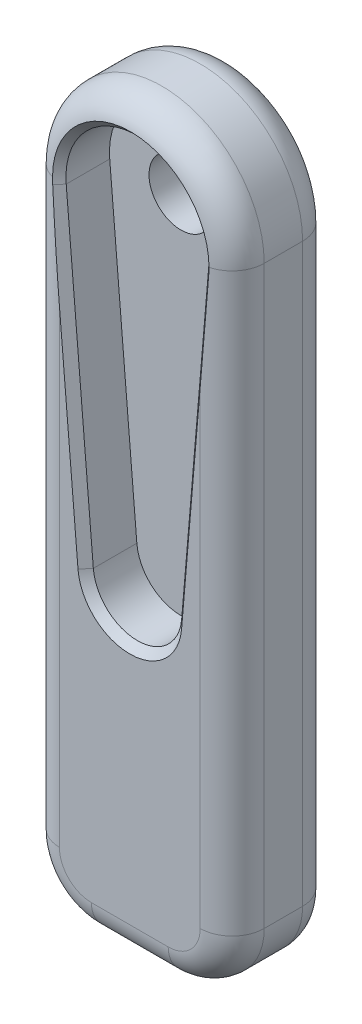
ISO-10303-21;
HEADER;
FILE_DESCRIPTION(('STEP AP214'),'2;1');
FILE_NAME('part.step','',(''),(''),'','','');
FILE_SCHEMA(('AUTOMOTIVE_DESIGN { 1 0 10303 214 1 1 1 1 }'));
ENDSEC;
DATA;
#1=APPLICATION_CONTEXT('core data for automotive mechanical design processes');
#2=APPLICATION_PROTOCOL_DEFINITION('international standard','automotive_design',2000,#1);
#3=PRODUCT_CONTEXT('',#1,'mechanical');
#4=PRODUCT('Part','Part','',(#3));
#5=PRODUCT_RELATED_PRODUCT_CATEGORY('part','',(#4));
#6=PRODUCT_DEFINITION_FORMATION('','',#4);
#7=PRODUCT_DEFINITION_CONTEXT('part definition',#1,'design');
#8=PRODUCT_DEFINITION('design','',#6,#7);
#9=PRODUCT_DEFINITION_SHAPE('','',#8);
#10=(LENGTH_UNIT() NAMED_UNIT(*) SI_UNIT(.MILLI.,.METRE.));
#11=(NAMED_UNIT(*) PLANE_ANGLE_UNIT() SI_UNIT($,.RADIAN.));
#12=(NAMED_UNIT(*) SI_UNIT($,.STERADIAN.) SOLID_ANGLE_UNIT());
#13=UNCERTAINTY_MEASURE_WITH_UNIT(LENGTH_MEASURE(1.E-05),#10,'distance_accuracy_value','');
#14=(GEOMETRIC_REPRESENTATION_CONTEXT(3) GLOBAL_UNCERTAINTY_ASSIGNED_CONTEXT((#13)) GLOBAL_UNIT_ASSIGNED_CONTEXT((#10,
#11,#12)) REPRESENTATION_CONTEXT('',''));
#15=CARTESIAN_POINT('',(0.,0.,0.));
#16=DIRECTION('',(0.,0.,1.));
#17=DIRECTION('',(1.,0.,0.));
#18=AXIS2_PLACEMENT_3D('',#15,#16,#17);
#19=CARTESIAN_POINT('',(0.,0.,2.54));
#20=DIRECTION('',(0.,0.,-1.));
#21=DIRECTION('',(-1.,0.,0.));
#22=AXIS2_PLACEMENT_3D('',#19,#20,#21);
#23=CYLINDRICAL_SURFACE('',#22,3.5484375);
#24=DIRECTION('',(0.,0.,-1.));
#25=VECTOR('',#24,1.);
#26=CARTESIAN_POINT('',(3.53570442699198,-0.300337970219434,2.54));
#27=LINE('',#26,#25);
#28=CARTESIAN_POINT('',(3.53570442699198,-0.300337970219434,2.159));
#29=VERTEX_POINT('',#28);
#30=CARTESIAN_POINT('',(3.53570442699198,-0.300337970219434,0.));
#31=VERTEX_POINT('',#30);
#32=EDGE_CURVE('E180',#29,#31,#27,.T.);
#33=ORIENTED_EDGE('',*,*,#32,.F.);
#34=CARTESIAN_POINT('',(0.,0.,2.159));
#35=DIRECTION('',(0.,0.,1.));
#36=DIRECTION('',(1.,0.,0.));
#37=AXIS2_PLACEMENT_3D('',#34,#35,#36);
#38=CIRCLE('',#37,3.5484375);
#39=CARTESIAN_POINT('',(-3.53570442699198,-0.300337970219432,2.159));
#40=VERTEX_POINT('',#39);
#41=EDGE_CURVE('E242',#29,#40,#38,.T.);
#42=ORIENTED_EDGE('',*,*,#41,.T.);
#43=DIRECTION('',(0.,0.,-1.));
#44=VECTOR('',#43,1.);
#45=CARTESIAN_POINT('',(-3.53570442699198,-0.300337970219432,2.54));
#46=LINE('',#45,#44);
#47=CARTESIAN_POINT('',(-3.53570442699198,-0.300337970219432,0.));
#48=VERTEX_POINT('',#47);
#49=EDGE_CURVE('E196',#40,#48,#46,.T.);
#50=ORIENTED_EDGE('',*,*,#49,.T.);
#51=CARTESIAN_POINT('',(0.,0.,0.));
#52=DIRECTION('',(0.,0.,1.));
#53=DIRECTION('',(1.,0.,0.));
#54=AXIS2_PLACEMENT_3D('',#51,#52,#53);
#55=CIRCLE('',#54,3.5484375);
#56=EDGE_CURVE('E194',#31,#48,#55,.T.);
#57=ORIENTED_EDGE('',*,*,#56,.F.);
#58=EDGE_LOOP('',(#33,#42,#50,#57));
#59=FACE_BOUND('',#58,.T.);
#60=ADVANCED_FACE('F45',(#59),#23,.F.);
#61=CARTESIAN_POINT('',(3.53570442699198,-0.300337970219435,2.54));
#62=DIRECTION('',(-0.996411639486953,0.0846394984326017,0.));
#63=DIRECTION('',(-0.0846394984326017,-0.996411639486953,0.));
#64=AXIS2_PLACEMENT_3D('',#61,#62,#63);
#65=PLANE('',#64);
#66=DIRECTION('',(0.,0.,-1.));
#67=VECTOR('',#66,1.);
#68=CARTESIAN_POINT('',(2.1905487136846,-16.1360746473354,2.54));
#69=LINE('',#68,#67);
#70=CARTESIAN_POINT('',(2.1905487136846,-16.1360746473354,2.159));
#71=VERTEX_POINT('',#70);
#72=CARTESIAN_POINT('',(2.1905487136846,-16.1360746473354,0.));
#73=VERTEX_POINT('',#72);
#74=EDGE_CURVE('E191',#71,#73,#69,.T.);
#75=ORIENTED_EDGE('',*,*,#74,.F.);
#76=DIRECTION('',(0.0846394984326017,0.996411639486953,0.));
#77=VECTOR('',#76,1.);
#78=CARTESIAN_POINT('',(3.53570442699198,-0.300337970219435,2.159));
#79=LINE('',#78,#77);
#80=EDGE_CURVE('E188',#71,#29,#79,.T.);
#81=ORIENTED_EDGE('',*,*,#80,.T.);
#82=ORIENTED_EDGE('',*,*,#32,.T.);
#83=DIRECTION('',(0.0846394984326017,0.996411639486953,0.));
#84=VECTOR('',#83,1.);
#85=CARTESIAN_POINT('',(3.53570442699198,-0.300337970219435,0.));
#86=LINE('',#85,#84);
#87=EDGE_CURVE('E185',#73,#31,#86,.T.);
#88=ORIENTED_EDGE('',*,*,#87,.F.);
#89=EDGE_LOOP('',(#75,#81,#82,#88));
#90=FACE_BOUND('',#89,.T.);
#91=ADVANCED_FACE('F183',(#90),#65,.T.);
#92=CARTESIAN_POINT('',(0.,-15.95,2.54));
#93=DIRECTION('',(0.,0.,-1.));
#94=DIRECTION('',(-1.,0.,0.));
#95=AXIS2_PLACEMENT_3D('',#92,#93,#94);
#96=CYLINDRICAL_SURFACE('',#95,2.1984375);
#97=DIRECTION('',(0.,0.,-1.));
#98=VECTOR('',#97,1.);
#99=CARTESIAN_POINT('',(-2.1905487136846,-16.1360746473354,2.54));
#100=LINE('',#99,#98);
#101=CARTESIAN_POINT('',(-2.1905487136846,-16.1360746473354,2.159));
#102=VERTEX_POINT('',#101);
#103=CARTESIAN_POINT('',(-2.1905487136846,-16.1360746473354,0.));
#104=VERTEX_POINT('',#103);
#105=EDGE_CURVE('E214',#102,#104,#100,.T.);
#106=ORIENTED_EDGE('',*,*,#105,.F.);
#107=CARTESIAN_POINT('',(0.,-15.95,2.159));
#108=DIRECTION('',(0.,0.,1.));
#109=DIRECTION('',(1.,0.,0.));
#110=AXIS2_PLACEMENT_3D('',#107,#108,#109);
#111=CIRCLE('',#110,2.1984375);
#112=EDGE_CURVE('E244',#102,#71,#111,.T.);
#113=ORIENTED_EDGE('',*,*,#112,.T.);
#114=ORIENTED_EDGE('',*,*,#74,.T.);
#115=CARTESIAN_POINT('',(0.,-15.95,0.));
#116=DIRECTION('',(0.,0.,1.));
#117=DIRECTION('',(1.,0.,0.));
#118=AXIS2_PLACEMENT_3D('',#115,#116,#117);
#119=CIRCLE('',#118,2.1984375);
#120=EDGE_CURVE('E205',#104,#73,#119,.T.);
#121=ORIENTED_EDGE('',*,*,#120,.F.);
#122=EDGE_LOOP('',(#106,#113,#114,#121));
#123=FACE_BOUND('',#122,.T.);
#124=ADVANCED_FACE('F453',(#123),#96,.F.);
#125=CARTESIAN_POINT('',(1.905,-28.575,2.54));
#126=DIRECTION('',(0.,0.,-1.));
#127=DIRECTION('',(-1.,0.,0.));
#128=AXIS2_PLACEMENT_3D('',#125,#126,#127);
#129=CYLINDRICAL_SURFACE('',#128,3.175);
#130=DIRECTION('',(0.,0.,-1.));
#131=VECTOR('',#130,1.);
#132=CARTESIAN_POINT('',(5.08,-28.575,2.54));
#133=LINE('',#132,#131);
#134=CARTESIAN_POINT('',(5.08,-28.575,0.9525));
#135=VERTEX_POINT('',#134);
#136=CARTESIAN_POINT('',(5.08,-28.575,-0.9525));
#137=VERTEX_POINT('',#136);
#138=EDGE_CURVE('E215',#135,#137,#133,.T.);
#139=ORIENTED_EDGE('',*,*,#138,.F.);
#140=CARTESIAN_POINT('',(1.905,-28.575,0.9525));
#141=DIRECTION('',(0.,0.,1.));
#142=DIRECTION('',(1.,0.,0.));
#143=AXIS2_PLACEMENT_3D('',#140,#141,#142);
#144=CIRCLE('',#143,3.175);
#145=CARTESIAN_POINT('',(1.90500000000001,-31.75,0.9525));
#146=VERTEX_POINT('',#145);
#147=EDGE_CURVE('E263',#135,#146,#144,.F.);
#148=ORIENTED_EDGE('',*,*,#147,.T.);
#149=DIRECTION('',(0.,0.,-1.));
#150=VECTOR('',#149,1.);
#151=CARTESIAN_POINT('',(1.90500000000001,-31.75,2.54));
#152=LINE('',#151,#150);
#153=CARTESIAN_POINT('',(1.90500000000001,-31.75,-0.9525));
#154=VERTEX_POINT('',#153);
#155=EDGE_CURVE('E212',#146,#154,#152,.T.);
#156=ORIENTED_EDGE('',*,*,#155,.T.);
#157=CARTESIAN_POINT('',(1.905,-28.575,-0.9525));
#158=DIRECTION('',(0.,0.,1.));
#159=DIRECTION('',(1.,0.,0.));
#160=AXIS2_PLACEMENT_3D('',#157,#158,#159);
#161=CIRCLE('',#160,3.175);
#162=EDGE_CURVE('E248',#154,#137,#161,.T.);
#163=ORIENTED_EDGE('',*,*,#162,.T.);
#164=EDGE_LOOP('',(#139,#148,#156,#163));
#165=FACE_BOUND('',#164,.T.);
#166=ADVANCED_FACE('F455',(#165),#129,.T.);
#167=CARTESIAN_POINT('',(5.08000000000001,0.,2.54));
#168=DIRECTION('',(-1.,0.,0.));
#169=DIRECTION('',(0.,-1.,0.));
#170=AXIS2_PLACEMENT_3D('',#167,#168,#169);
#171=PLANE('',#170);
#172=DIRECTION('',(0.,0.,-1.));
#173=VECTOR('',#172,1.);
#174=CARTESIAN_POINT('',(5.08000000000001,0.,2.54));
#175=LINE('',#174,#173);
#176=CARTESIAN_POINT('',(5.08000000000001,0.,0.9525));
#177=VERTEX_POINT('',#176);
#178=CARTESIAN_POINT('',(5.08000000000001,0.,-0.9525));
#179=VERTEX_POINT('',#178);
#180=EDGE_CURVE('E229',#177,#179,#175,.T.);
#181=ORIENTED_EDGE('',*,*,#180,.F.);
#182=DIRECTION('',(0.,1.,0.));
#183=VECTOR('',#182,1.);
#184=CARTESIAN_POINT('',(5.08,-28.575,0.9525));
#185=LINE('',#184,#183);
#186=EDGE_CURVE('E11',#177,#135,#185,.F.);
#187=ORIENTED_EDGE('',*,*,#186,.T.);
#188=ORIENTED_EDGE('',*,*,#138,.T.);
#189=DIRECTION('',(0.,1.,0.));
#190=VECTOR('',#189,1.);
#191=CARTESIAN_POINT('',(5.08000000000001,0.,-0.9525));
#192=LINE('',#191,#190);
#193=EDGE_CURVE('E54',#137,#179,#192,.T.);
#194=ORIENTED_EDGE('',*,*,#193,.T.);
#195=EDGE_LOOP('',(#181,#187,#188,#194));
#196=FACE_BOUND('',#195,.T.);
#197=ADVANCED_FACE('F443',(#196),#171,.F.);
#198=CARTESIAN_POINT('',(0.,0.,2.54));
#199=DIRECTION('',(0.,0.,-1.));
#200=DIRECTION('',(-1.,0.,0.));
#201=AXIS2_PLACEMENT_3D('',#198,#199,#200);
#202=CYLINDRICAL_SURFACE('',#201,5.08000000000001);
#203=DIRECTION('',(0.,0.,-1.));
#204=VECTOR('',#203,1.);
#205=CARTESIAN_POINT('',(-5.08000000000001,0.,2.54));
#206=LINE('',#205,#204);
#207=CARTESIAN_POINT('',(-5.08000000000001,0.,0.9525));
#208=VERTEX_POINT('',#207);
#209=CARTESIAN_POINT('',(-5.08000000000001,0.,-0.9525));
#210=VERTEX_POINT('',#209);
#211=EDGE_CURVE('E226',#208,#210,#206,.T.);
#212=ORIENTED_EDGE('',*,*,#211,.F.);
#213=CARTESIAN_POINT('',(0.,0.,0.9525));
#214=DIRECTION('',(0.,0.,1.));
#215=DIRECTION('',(1.,0.,0.));
#216=AXIS2_PLACEMENT_3D('',#213,#214,#215);
#217=CIRCLE('',#216,5.08000000000001);
#218=EDGE_CURVE('E287',#208,#177,#217,.F.);
#219=ORIENTED_EDGE('',*,*,#218,.T.);
#220=ORIENTED_EDGE('',*,*,#180,.T.);
#221=CARTESIAN_POINT('',(0.,0.,-0.9525));
#222=DIRECTION('',(0.,0.,1.));
#223=DIRECTION('',(1.,0.,0.));
#224=AXIS2_PLACEMENT_3D('',#221,#222,#223);
#225=CIRCLE('',#224,5.08000000000001);
#226=EDGE_CURVE('E285',#179,#210,#225,.T.);
#227=ORIENTED_EDGE('',*,*,#226,.T.);
#228=EDGE_LOOP('',(#212,#219,#220,#227));
#229=FACE_BOUND('',#228,.T.);
#230=ADVANCED_FACE('F439',(#229),#202,.T.);
#231=CARTESIAN_POINT('',(-5.08000000000001,0.,2.54));
#232=DIRECTION('',(-1.,0.,0.));
#233=DIRECTION('',(0.,-1.,0.));
#234=AXIS2_PLACEMENT_3D('',#231,#232,#233);
#235=PLANE('',#234);
#236=DIRECTION('',(0.,0.,-1.));
#237=VECTOR('',#236,1.);
#238=CARTESIAN_POINT('',(-5.08,-28.575,2.54));
#239=LINE('',#238,#237);
#240=CARTESIAN_POINT('',(-5.08,-28.575,0.9525));
#241=VERTEX_POINT('',#240);
#242=CARTESIAN_POINT('',(-5.08,-28.575,-0.9525));
#243=VERTEX_POINT('',#242);
#244=EDGE_CURVE('E223',#241,#243,#239,.T.);
#245=ORIENTED_EDGE('',*,*,#244,.F.);
#246=DIRECTION('',(0.,1.,0.));
#247=VECTOR('',#246,1.);
#248=CARTESIAN_POINT('',(-5.08000000000001,0.,0.9525));
#249=LINE('',#248,#247);
#250=EDGE_CURVE('E283',#241,#208,#249,.T.);
#251=ORIENTED_EDGE('',*,*,#250,.T.);
#252=ORIENTED_EDGE('',*,*,#211,.T.);
#253=DIRECTION('',(0.,1.,0.));
#254=VECTOR('',#253,1.);
#255=CARTESIAN_POINT('',(-5.08,-28.575,-0.9525));
#256=LINE('',#255,#254);
#257=EDGE_CURVE('E281',#210,#243,#256,.F.);
#258=ORIENTED_EDGE('',*,*,#257,.T.);
#259=EDGE_LOOP('',(#245,#251,#252,#258));
#260=FACE_BOUND('',#259,.T.);
#261=ADVANCED_FACE('F394',(#260),#235,.T.);
#262=CARTESIAN_POINT('',(-1.905,-28.575,2.54));
#263=DIRECTION('',(0.,0.,-1.));
#264=DIRECTION('',(-1.,0.,0.));
#265=AXIS2_PLACEMENT_3D('',#262,#263,#264);
#266=CYLINDRICAL_SURFACE('',#265,3.175);
#267=DIRECTION('',(0.,0.,-1.));
#268=VECTOR('',#267,1.);
#269=CARTESIAN_POINT('',(-1.905,-31.75,2.54));
#270=LINE('',#269,#268);
#271=CARTESIAN_POINT('',(-1.905,-31.75,0.9525));
#272=VERTEX_POINT('',#271);
#273=CARTESIAN_POINT('',(-1.905,-31.75,-0.9525));
#274=VERTEX_POINT('',#273);
#275=EDGE_CURVE('E220',#272,#274,#270,.T.);
#276=ORIENTED_EDGE('',*,*,#275,.F.);
#277=CARTESIAN_POINT('',(-1.905,-28.575,0.9525));
#278=DIRECTION('',(0.,0.,1.));
#279=DIRECTION('',(1.,0.,0.));
#280=AXIS2_PLACEMENT_3D('',#277,#278,#279);
#281=CIRCLE('',#280,3.175);
#282=EDGE_CURVE('E279',#272,#241,#281,.F.);
#283=ORIENTED_EDGE('',*,*,#282,.T.);
#284=ORIENTED_EDGE('',*,*,#244,.T.);
#285=CARTESIAN_POINT('',(-1.905,-28.575,-0.9525));
#286=DIRECTION('',(0.,0.,1.));
#287=DIRECTION('',(1.,0.,0.));
#288=AXIS2_PLACEMENT_3D('',#285,#286,#287);
#289=CIRCLE('',#288,3.175);
#290=EDGE_CURVE('E277',#243,#274,#289,.T.);
#291=ORIENTED_EDGE('',*,*,#290,.T.);
#292=EDGE_LOOP('',(#276,#283,#284,#291));
#293=FACE_BOUND('',#292,.T.);
#294=ADVANCED_FACE('F399',(#293),#266,.T.);
#295=CARTESIAN_POINT('',(0.,-31.75,2.54));
#296=DIRECTION('',(0.,1.,0.));
#297=DIRECTION('',(0.,0.,1.));
#298=AXIS2_PLACEMENT_3D('',#295,#296,#297);
#299=PLANE('',#298);
#300=ORIENTED_EDGE('',*,*,#155,.F.);
#301=DIRECTION('',(1.,0.,0.));
#302=VECTOR('',#301,1.);
#303=CARTESIAN_POINT('',(-1.905,-31.75,0.9525));
#304=LINE('',#303,#302);
#305=EDGE_CURVE('E349',#146,#272,#304,.F.);
#306=ORIENTED_EDGE('',*,*,#305,.T.);
#307=ORIENTED_EDGE('',*,*,#275,.T.);
#308=DIRECTION('',(1.,0.,0.));
#309=VECTOR('',#308,1.);
#310=CARTESIAN_POINT('',(0.,-31.75,-0.9525));
#311=LINE('',#310,#309);
#312=EDGE_CURVE('E347',#274,#154,#311,.T.);
#313=ORIENTED_EDGE('',*,*,#312,.T.);
#314=EDGE_LOOP('',(#300,#306,#307,#313));
#315=FACE_BOUND('',#314,.T.);
#316=ADVANCED_FACE('F472',(#315),#299,.F.);
#317=CARTESIAN_POINT('',(-3.53570442699198,-0.300337970219435,2.54));
#318=DIRECTION('',(0.996411639486953,0.0846394984326018,0.));
#319=DIRECTION('',(-0.0846394984326018,0.996411639486953,0.));
#320=AXIS2_PLACEMENT_3D('',#317,#318,#319);
#321=PLANE('',#320);
#322=ORIENTED_EDGE('',*,*,#49,.F.);
#323=DIRECTION('',(0.0846394984326018,-0.996411639486953,0.));
#324=VECTOR('',#323,1.);
#325=CARTESIAN_POINT('',(-3.53570442699198,-0.300337970219435,2.159));
#326=LINE('',#325,#324);
#327=EDGE_CURVE('E246',#40,#102,#326,.T.);
#328=ORIENTED_EDGE('',*,*,#327,.T.);
#329=ORIENTED_EDGE('',*,*,#105,.T.);
#330=DIRECTION('',(0.0846394984326018,-0.996411639486953,0.));
#331=VECTOR('',#330,1.);
#332=CARTESIAN_POINT('',(-3.53570442699198,-0.300337970219435,0.));
#333=LINE('',#332,#331);
#334=EDGE_CURVE('E207',#48,#104,#333,.T.);
#335=ORIENTED_EDGE('',*,*,#334,.F.);
#336=EDGE_LOOP('',(#322,#328,#329,#335));
#337=FACE_BOUND('',#336,.T.);
#338=ADVANCED_FACE('F450',(#337),#321,.T.);
#339=CARTESIAN_POINT('',(0.,0.,2.54));
#340=DIRECTION('',(0.,0.,1.));
#341=DIRECTION('',(1.,0.,0.));
#342=AXIS2_PLACEMENT_3D('',#339,#340,#341);
#343=PLANE('',#342);
#344=DIRECTION('',(-0.0846394984326018,0.996411639486953,0.));
#345=VECTOR('',#344,1.);
#346=CARTESIAN_POINT('',(-3.91533726163651,-0.332585619122257,2.54));
#347=LINE('',#346,#345);
#348=CARTESIAN_POINT('',(-2.57018154832913,-16.1683222962382,2.54));
#349=VERTEX_POINT('',#348);
#350=CARTESIAN_POINT('',(-3.4925,-5.31040303186253,2.54));
#351=VERTEX_POINT('',#350);
#352=EDGE_CURVE('E235',#349,#351,#347,.T.);
#353=ORIENTED_EDGE('',*,*,#352,.T.);
#354=DIRECTION('',(0.,1.,0.));
#355=VECTOR('',#354,1.);
#356=CARTESIAN_POINT('',(-3.49250000000001,0.,2.54));
#357=LINE('',#356,#355);
#358=CARTESIAN_POINT('',(-3.4925,-28.575,2.54));
#359=VERTEX_POINT('',#358);
#360=EDGE_CURVE('E275',#351,#359,#357,.F.);
#361=ORIENTED_EDGE('',*,*,#360,.T.);
#362=CARTESIAN_POINT('',(-1.905,-28.575,2.54));
#363=DIRECTION('',(0.,0.,1.));
#364=DIRECTION('',(1.,0.,0.));
#365=AXIS2_PLACEMENT_3D('',#362,#363,#364);
#366=CIRCLE('',#365,1.5875);
#367=CARTESIAN_POINT('',(-1.905,-30.1625,2.54));
#368=VERTEX_POINT('',#367);
#369=EDGE_CURVE('E273',#359,#368,#366,.T.);
#370=ORIENTED_EDGE('',*,*,#369,.T.);
#371=DIRECTION('',(1.,0.,0.));
#372=VECTOR('',#371,1.);
#373=CARTESIAN_POINT('',(1.90500000000001,-30.1625,2.54));
#374=LINE('',#373,#372);
#375=CARTESIAN_POINT('',(1.90500000000001,-30.1625,2.54));
#376=VERTEX_POINT('',#375);
#377=EDGE_CURVE('E271',#368,#376,#374,.T.);
#378=ORIENTED_EDGE('',*,*,#377,.T.);
#379=CARTESIAN_POINT('',(1.905,-28.575,2.54));
#380=DIRECTION('',(0.,0.,1.));
#381=DIRECTION('',(1.,0.,0.));
#382=AXIS2_PLACEMENT_3D('',#379,#380,#381);
#383=CIRCLE('',#382,1.5875);
#384=CARTESIAN_POINT('',(3.4925,-28.575,2.54));
#385=VERTEX_POINT('',#384);
#386=EDGE_CURVE('E268',#376,#385,#383,.T.);
#387=ORIENTED_EDGE('',*,*,#386,.T.);
#388=DIRECTION('',(0.,1.,0.));
#389=VECTOR('',#388,1.);
#390=CARTESIAN_POINT('',(3.49250000000001,0.,2.54));
#391=LINE('',#390,#389);
#392=CARTESIAN_POINT('',(3.49250000000001,-5.31040303186254,2.54));
#393=VERTEX_POINT('',#392);
#394=EDGE_CURVE('E266',#385,#393,#391,.T.);
#395=ORIENTED_EDGE('',*,*,#394,.T.);
#396=DIRECTION('',(-0.0846394984326017,-0.996411639486953,0.));
#397=VECTOR('',#396,1.);
#398=CARTESIAN_POINT('',(3.91533726163652,-0.332585619122257,2.54));
#399=LINE('',#398,#397);
#400=CARTESIAN_POINT('',(2.57018154832913,-16.1683222962382,2.54));
#401=VERTEX_POINT('',#400);
#402=EDGE_CURVE('E240',#393,#401,#399,.T.);
#403=ORIENTED_EDGE('',*,*,#402,.T.);
#404=CARTESIAN_POINT('',(0.,-15.95,2.54));
#405=DIRECTION('',(0.,0.,1.));
#406=DIRECTION('',(1.,0.,0.));
#407=AXIS2_PLACEMENT_3D('',#404,#405,#406);
#408=CIRCLE('',#407,2.5794375);
#409=EDGE_CURVE('E238',#401,#349,#408,.F.);
#410=ORIENTED_EDGE('',*,*,#409,.T.);
#411=EDGE_LOOP('',(#353,#361,#370,#378,#387,#395,#403,#410));
#412=FACE_BOUND('',#411,.T.);
#413=ADVANCED_FACE('F410',(#412),#343,.T.);
#414=CARTESIAN_POINT('',(0.,0.,-2.54));
#415=DIRECTION('',(0.,0.,1.));
#416=DIRECTION('',(1.,0.,0.));
#417=AXIS2_PLACEMENT_3D('',#414,#415,#416);
#418=CYLINDRICAL_SURFACE('',#417,1.5875);
#419=CARTESIAN_POINT('',(0.,0.,-2.54));
#420=DIRECTION('',(0.,0.,1.));
#421=DIRECTION('',(1.,0.,0.));
#422=AXIS2_PLACEMENT_3D('',#419,#420,#421);
#423=CIRCLE('',#422,1.5875);
#424=CARTESIAN_POINT('',(1.5875,0.,-2.54));
#425=VERTEX_POINT('',#424);
#426=EDGE_CURVE('E200',#425,#425,#423,.T.);
#427=ORIENTED_EDGE('',*,*,#426,.F.);
#428=EDGE_LOOP('',(#427));
#429=FACE_BOUND('',#428,.T.);
#430=CARTESIAN_POINT('',(0.,0.,0.));
#431=DIRECTION('',(0.,0.,1.));
#432=DIRECTION('',(1.,0.,0.));
#433=AXIS2_PLACEMENT_3D('',#430,#431,#432);
#434=CIRCLE('',#433,1.5875);
#435=CARTESIAN_POINT('',(1.5875,0.,0.));
#436=VERTEX_POINT('',#435);
#437=EDGE_CURVE('E260',#436,#436,#434,.T.);
#438=ORIENTED_EDGE('',*,*,#437,.T.);
#439=EDGE_LOOP('',(#438));
#440=FACE_BOUND('',#439,.T.);
#441=ADVANCED_FACE('F565',(#429,#440),#418,.F.);
#442=CARTESIAN_POINT('',(0.,0.,-2.54));
#443=DIRECTION('',(0.,0.,1.));
#444=DIRECTION('',(1.,0.,0.));
#445=AXIS2_PLACEMENT_3D('',#442,#443,#444);
#446=PLANE('',#445);
#447=CARTESIAN_POINT('',(1.905,-28.575,-2.54));
#448=DIRECTION('',(0.,0.,1.));
#449=DIRECTION('',(1.,0.,0.));
#450=AXIS2_PLACEMENT_3D('',#447,#448,#449);
#451=CIRCLE('',#450,1.5875);
#452=CARTESIAN_POINT('',(3.4925,-28.575,-2.54));
#453=VERTEX_POINT('',#452);
#454=CARTESIAN_POINT('',(1.90500000000001,-30.1625,-2.54));
#455=VERTEX_POINT('',#454);
#456=EDGE_CURVE('E344',#453,#455,#451,.F.);
#457=ORIENTED_EDGE('',*,*,#456,.T.);
#458=DIRECTION('',(1.,0.,0.));
#459=VECTOR('',#458,1.);
#460=CARTESIAN_POINT('',(0.,-30.1625,-2.54));
#461=LINE('',#460,#459);
#462=CARTESIAN_POINT('',(-1.905,-30.1625,-2.54));
#463=VERTEX_POINT('',#462);
#464=EDGE_CURVE('E69',#455,#463,#461,.F.);
#465=ORIENTED_EDGE('',*,*,#464,.T.);
#466=CARTESIAN_POINT('',(-1.905,-28.575,-2.54));
#467=DIRECTION('',(0.,0.,1.));
#468=DIRECTION('',(1.,0.,0.));
#469=AXIS2_PLACEMENT_3D('',#466,#467,#468);
#470=CIRCLE('',#469,1.5875);
#471=CARTESIAN_POINT('',(-3.4925,-28.575,-2.54));
#472=VERTEX_POINT('',#471);
#473=EDGE_CURVE('E342',#463,#472,#470,.F.);
#474=ORIENTED_EDGE('',*,*,#473,.T.);
#475=DIRECTION('',(0.,1.,0.));
#476=VECTOR('',#475,1.);
#477=CARTESIAN_POINT('',(-3.49250000000001,0.,-2.54));
#478=LINE('',#477,#476);
#479=CARTESIAN_POINT('',(-3.49250000000001,0.,-2.54));
#480=VERTEX_POINT('',#479);
#481=EDGE_CURVE('E340',#472,#480,#478,.T.);
#482=ORIENTED_EDGE('',*,*,#481,.T.);
#483=CARTESIAN_POINT('',(0.,0.,-2.54));
#484=DIRECTION('',(0.,0.,1.));
#485=DIRECTION('',(1.,0.,0.));
#486=AXIS2_PLACEMENT_3D('',#483,#484,#485);
#487=CIRCLE('',#486,3.49250000000001);
#488=CARTESIAN_POINT('',(3.49250000000001,0.,-2.54));
#489=VERTEX_POINT('',#488);
#490=EDGE_CURVE('E338',#480,#489,#487,.F.);
#491=ORIENTED_EDGE('',*,*,#490,.T.);
#492=DIRECTION('',(0.,1.,0.));
#493=VECTOR('',#492,1.);
#494=CARTESIAN_POINT('',(3.49250000000001,0.,-2.54));
#495=LINE('',#494,#493);
#496=EDGE_CURVE('E336',#489,#453,#495,.F.);
#497=ORIENTED_EDGE('',*,*,#496,.T.);
#498=EDGE_LOOP('',(#457,#465,#474,#482,#491,#497));
#499=FACE_BOUND('',#498,.T.);
#500=ORIENTED_EDGE('',*,*,#426,.T.);
#501=EDGE_LOOP('',(#500));
#502=FACE_BOUND('',#501,.T.);
#503=ADVANCED_FACE('F558',(#499,#502),#446,.F.);
#504=CARTESIAN_POINT('',(0.,0.,0.));
#505=DIRECTION('',(0.,0.,1.));
#506=DIRECTION('',(1.,0.,0.));
#507=AXIS2_PLACEMENT_3D('',#504,#505,#506);
#508=PLANE('',#507);
#509=ORIENTED_EDGE('',*,*,#87,.T.);
#510=ORIENTED_EDGE('',*,*,#56,.T.);
#511=ORIENTED_EDGE('',*,*,#334,.T.);
#512=ORIENTED_EDGE('',*,*,#120,.T.);
#513=EDGE_LOOP('',(#509,#510,#511,#512));
#514=FACE_BOUND('',#513,.T.);
#515=ORIENTED_EDGE('',*,*,#437,.F.);
#516=EDGE_LOOP('',(#515));
#517=FACE_BOUND('',#516,.T.);
#518=ADVANCED_FACE('F202',(#514,#517),#508,.T.);
#519=CARTESIAN_POINT('',(-3.53570442699198,-0.300337970219435,2.159));
#520=DIRECTION('',(-0.70456942713443,-0.0598491632979209,-0.707106781186547));
#521=DIRECTION('',(0.0846394984326018,-0.996411639486953,0.));
#522=AXIS2_PLACEMENT_3D('',#519,#520,#521);
#523=PLANE('',#522);
#524=DIRECTION('',(0.704569427134429,0.0598491632979204,-0.707106781186548));
#525=VECTOR('',#524,1.);
#526=CARTESIAN_POINT('',(-3.91533726163651,-0.332585619122254,2.54));
#527=LINE('',#526,#525);
#528=CARTESIAN_POINT('',(-3.86997081768384,-0.328731997878124,2.49447017863417));
#529=VERTEX_POINT('',#528);
#530=EDGE_CURVE('E255',#529,#40,#527,.T.);
#531=ORIENTED_EDGE('',*,*,#530,.F.);
#532=CARTESIAN_POINT('',(-3.49250000000001,13.4456154866561,0.9525));
#533=DIRECTION('',(-0.70456942713443,-0.0598491632979209,-0.707106781186547));
#534=DIRECTION('',(-0.0422436152447244,0.998207432176569,-0.0423957464672683));
#535=AXIS2_PLACEMENT_3D('',#532,#533,#534);
#536=ELLIPSE('',#535,26.5250157650099,1.5875);
#537=EDGE_CURVE('E334',#529,#351,#536,.F.);
#538=ORIENTED_EDGE('',*,*,#537,.T.);
#539=ORIENTED_EDGE('',*,*,#352,.F.);
#540=DIRECTION('',(-0.70456942713443,-0.0598491632979172,0.707106781186548));
#541=VECTOR('',#540,1.);
#542=CARTESIAN_POINT('',(-2.1905487136846,-16.1360746473354,2.159));
#543=LINE('',#542,#541);
#544=EDGE_CURVE('E257',#102,#349,#543,.T.);
#545=ORIENTED_EDGE('',*,*,#544,.F.);
#546=ORIENTED_EDGE('',*,*,#327,.F.);
#547=EDGE_LOOP('',(#531,#538,#539,#545,#546));
#548=FACE_BOUND('',#547,.T.);
#549=ADVANCED_FACE('F432',(#548),#523,.F.);
#550=CARTESIAN_POINT('',(0.,-15.95,2.159));
#551=DIRECTION('',(0.,0.,1.));
#552=DIRECTION('',(1.,0.,0.));
#553=AXIS2_PLACEMENT_3D('',#550,#551,#552);
#554=CONICAL_SURFACE('',#553,2.1984375,0.785398163397448);
#555=ORIENTED_EDGE('',*,*,#544,.T.);
#556=ORIENTED_EDGE('',*,*,#409,.F.);
#557=DIRECTION('',(0.70456942713443,-0.0598491632979236,0.707106781186548));
#558=VECTOR('',#557,1.);
#559=CARTESIAN_POINT('',(2.1905487136846,-16.1360746473354,2.159));
#560=LINE('',#559,#558);
#561=EDGE_CURVE('E251',#71,#401,#560,.T.);
#562=ORIENTED_EDGE('',*,*,#561,.F.);
#563=ORIENTED_EDGE('',*,*,#112,.F.);
#564=EDGE_LOOP('',(#555,#556,#562,#563));
#565=FACE_BOUND('',#564,.T.);
#566=ADVANCED_FACE('F426',(#565),#554,.F.);
#567=CARTESIAN_POINT('',(0.,0.,2.159));
#568=DIRECTION('',(0.,0.,1.));
#569=DIRECTION('',(1.,0.,0.));
#570=AXIS2_PLACEMENT_3D('',#567,#568,#569);
#571=CONICAL_SURFACE('',#570,3.5484375,0.785398163397449);
#572=CARTESIAN_POINT('',(0.,0.,2.4916949434386));
#573=DIRECTION('',(0.,0.,-1.));
#574=DIRECTION('',(-1.,0.,0.));
#575=AXIS2_PLACEMENT_3D('',#572,#573,#574);
#576=CIRCLE('',#575,3.8811324434386);
#577=CARTESIAN_POINT('',(3.8811324434386,0.,2.4916949434386));
#578=VERTEX_POINT('',#577);
#579=CARTESIAN_POINT('',(-3.8811324434386,0.,2.4916949434386));
#580=VERTEX_POINT('',#579);
#581=EDGE_CURVE('E297',#578,#580,#576,.F.);
#582=ORIENTED_EDGE('',*,*,#581,.T.);
#583=CARTESIAN_POINT('',(-3.8811324434386,0.,2.4916949434386));
#584=CARTESIAN_POINT('',(-3.8811281687175,-0.0649472700295239,2.4916910479619));
#585=CARTESIAN_POINT('',(-3.87983132889511,-0.129883278685392,2.49202451457239));
#586=CARTESIAN_POINT('',(-3.87461875442262,-0.259645533484615,2.49332799304381));
#587=CARTESIAN_POINT('',(-3.87070293825882,-0.324471776148624,2.49429802471736));
#588=CARTESIAN_POINT('',(-3.85506453085807,-0.517561921566733,2.49808434741519));
#589=CARTESIAN_POINT('',(-3.83945166766028,-0.645530964340416,2.50177816786933));
#590=CARTESIAN_POINT('',(-3.80769741041646,-0.836036206509601,2.50842951975546));
#591=CARTESIAN_POINT('',(-3.79571873037502,-0.899315030528628,2.51083261399322));
#592=CARTESIAN_POINT('',(-3.7688323664144,-1.02523797308256,2.51582488282911));
#593=CARTESIAN_POINT('',(-3.75392511621242,-1.08788218415989,2.51841402983712));
#594=CARTESIAN_POINT('',(-3.72086832959004,-1.21286670114262,2.52357934989824));
#595=CARTESIAN_POINT('',(-3.70269320771312,-1.27520030235234,2.52615524245082));
#596=CARTESIAN_POINT('',(-3.6629179453639,-1.398811757345,2.5309488381288));
#597=CARTESIAN_POINT('',(-3.64131600976502,-1.460089039021,2.5331663522827));
#598=CARTESIAN_POINT('',(-3.6178767443093,-1.52069116028792,2.53504128602903));
#599=B_SPLINE_CURVE_WITH_KNOTS('',3,(#583,#584,#585,#586,#587,#588,#589,#590,#591,#592,#593,
#594,#595,#596,#597,#598),.UNSPECIFIED.,.F.,.F.,(4,2,2,2,2,2,2,4),(0.,0.194805058932056,
0.389616181309786,0.775966785384163,0.96925622529454,1.16251706085603,1.3573627044451,
1.5523107564892),.UNSPECIFIED.);
#600=EDGE_CURVE('E328',#580,#529,#599,.T.);
#601=ORIENTED_EDGE('',*,*,#600,.T.);
#602=ORIENTED_EDGE('',*,*,#530,.T.);
#603=ORIENTED_EDGE('',*,*,#41,.F.);
#604=DIRECTION('',(-0.70456942713443,0.0598491632979209,-0.707106781186548));
#605=VECTOR('',#604,1.);
#606=CARTESIAN_POINT('',(3.91533726163651,-0.332585619122255,2.54));
#607=LINE('',#606,#605);
#608=CARTESIAN_POINT('',(3.86997081768384,-0.328731997878126,2.49447017863417));
#609=VERTEX_POINT('',#608);
#610=EDGE_CURVE('E249',#609,#29,#607,.T.);
#611=ORIENTED_EDGE('',*,*,#610,.F.);
#612=CARTESIAN_POINT('',(3.86997081768384,-0.328731997878126,2.49447017863417));
#613=CARTESIAN_POINT('',(3.87446422709112,-0.262767278720999,2.4933646116909));
#614=CARTESIAN_POINT('',(3.87759693014947,-0.196716768002372,2.4925835075951));
#615=CARTESIAN_POINT('',(3.88115539935105,-0.0645392122510756,2.49169113657738));
#616=CARTESIAN_POINT('',(3.88158120420462,0.00158783167359335,2.49157986007649));
#617=CARTESIAN_POINT('',(3.87883441877738,0.198916705892142,2.49227846727397));
#618=CARTESIAN_POINT('',(3.87170666793845,0.330094117073543,2.49410304402166));
#619=CARTESIAN_POINT('',(3.85282972596236,0.525993219121713,2.49857680626381));
#620=CARTESIAN_POINT('',(3.84517094165733,0.591160814000046,2.50035805074725));
#621=CARTESIAN_POINT('',(3.82702869557644,0.721088820411622,2.5043809155386));
#622=CARTESIAN_POINT('',(3.81654546880486,0.785849265362733,2.50662249754101));
#623=CARTESIAN_POINT('',(3.79254475010431,0.915305158016352,2.51143652029349));
#624=CARTESIAN_POINT('',(3.77900481818457,0.979996376618016,2.5140113445567));
#625=CARTESIAN_POINT('',(3.7487507141193,1.10864596643193,2.51925357932643));
#626=CARTESIAN_POINT('',(3.73203564641023,1.17260412547117,2.52192101578081));
#627=CARTESIAN_POINT('',(3.71364381307111,1.23609257392968,2.52452152146221));
#628=B_SPLINE_CURVE_WITH_KNOTS('',3,(#612,#613,#614,#615,#616,#617,#618,#619,#620,#621,#622,
#623,#624,#625,#626,#627),.UNSPECIFIED.,.F.,.F.,(4,2,2,2,2,2,2,4),(0.,0.198341342505263,
0.396679848597711,0.790275163957863,0.987148239303645,1.18400493912114,1.38235672870902,
1.58076454774366),.UNSPECIFIED.);
#629=EDGE_CURVE('E289',#609,#578,#628,.T.);
#630=ORIENTED_EDGE('',*,*,#629,.T.);
#631=EDGE_LOOP('',(#582,#601,#602,#603,#611,#630));
#632=FACE_BOUND('',#631,.T.);
#633=ADVANCED_FACE('F300',(#632),#571,.F.);
#634=CARTESIAN_POINT('',(3.53570442699198,-0.300337970219435,2.159));
#635=DIRECTION('',(0.70456942713443,-0.0598491632979208,-0.707106781186548));
#636=DIRECTION('',(0.0846394984326017,0.996411639486953,0.));
#637=AXIS2_PLACEMENT_3D('',#634,#635,#636);
#638=PLANE('',#637);
#639=ORIENTED_EDGE('',*,*,#402,.F.);
#640=CARTESIAN_POINT('',(3.49250000000001,13.445615486656,0.9525));
#641=DIRECTION('',(0.70456942713443,-0.0598491632979208,-0.707106781186548));
#642=DIRECTION('',(-0.0422436152447241,-0.998207432176569,0.0423957464672684));
#643=AXIS2_PLACEMENT_3D('',#640,#641,#642);
#644=ELLIPSE('',#643,26.5250157650099,1.5875);
#645=EDGE_CURVE('E351',#393,#609,#644,.F.);
#646=ORIENTED_EDGE('',*,*,#645,.T.);
#647=ORIENTED_EDGE('',*,*,#610,.T.);
#648=ORIENTED_EDGE('',*,*,#80,.F.);
#649=ORIENTED_EDGE('',*,*,#561,.T.);
#650=EDGE_LOOP('',(#639,#646,#647,#648,#649));
#651=FACE_BOUND('',#650,.T.);
#652=ADVANCED_FACE('F324',(#651),#638,.F.);
#653=CARTESIAN_POINT('',(-3.49250000000001,0.,0.9525));
#654=DIRECTION('',(0.,1.,0.));
#655=DIRECTION('',(-1.,0.,0.));
#656=AXIS2_PLACEMENT_3D('',#653,#654,#655);
#657=CYLINDRICAL_SURFACE('',#656,1.5875);
#658=ORIENTED_EDGE('',*,*,#537,.F.);
#659=ORIENTED_EDGE('',*,*,#600,.F.);
#660=CARTESIAN_POINT('',(-3.49250000000001,0.,0.9525));
#661=DIRECTION('',(0.,1.,0.));
#662=DIRECTION('',(-1.,0.,0.));
#663=AXIS2_PLACEMENT_3D('',#660,#661,#662);
#664=CIRCLE('',#663,1.5875);
#665=EDGE_CURVE('E252',#208,#580,#664,.T.);
#666=ORIENTED_EDGE('',*,*,#665,.F.);
#667=ORIENTED_EDGE('',*,*,#250,.F.);
#668=CARTESIAN_POINT('',(-3.4925,-28.575,0.9525));
#669=DIRECTION('',(0.,-1.,0.));
#670=DIRECTION('',(0.,0.,-1.));
#671=AXIS2_PLACEMENT_3D('',#668,#669,#670);
#672=CIRCLE('',#671,1.5875);
#673=EDGE_CURVE('E364',#359,#241,#672,.T.);
#674=ORIENTED_EDGE('',*,*,#673,.F.);
#675=ORIENTED_EDGE('',*,*,#360,.F.);
#676=EDGE_LOOP('',(#658,#659,#666,#667,#674,#675));
#677=FACE_BOUND('',#676,.T.);
#678=ADVANCED_FACE('F319',(#677),#657,.T.);
#679=CARTESIAN_POINT('',(0.,0.,0.9525));
#680=DIRECTION('',(0.,0.,1.));
#681=DIRECTION('',(1.,0.,0.));
#682=AXIS2_PLACEMENT_3D('',#679,#680,#681);
#683=TOROIDAL_SURFACE('',#682,3.49250000000001,1.5875);
#684=ORIENTED_EDGE('',*,*,#665,.T.);
#685=ORIENTED_EDGE('',*,*,#581,.F.);
#686=CARTESIAN_POINT('',(3.49250000000001,0.,0.9525));
#687=DIRECTION('',(0.,-1.,0.));
#688=DIRECTION('',(1.,0.,0.));
#689=AXIS2_PLACEMENT_3D('',#686,#687,#688);
#690=CIRCLE('',#689,1.5875);
#691=EDGE_CURVE('E361',#177,#578,#690,.T.);
#692=ORIENTED_EDGE('',*,*,#691,.F.);
#693=ORIENTED_EDGE('',*,*,#218,.F.);
#694=EDGE_LOOP('',(#684,#685,#692,#693));
#695=FACE_BOUND('',#694,.T.);
#696=ADVANCED_FACE('F315',(#695),#683,.T.);
#697=CARTESIAN_POINT('',(-1.905,-28.575,0.9525));
#698=DIRECTION('',(0.,0.,1.));
#699=DIRECTION('',(1.,0.,0.));
#700=AXIS2_PLACEMENT_3D('',#697,#698,#699);
#701=DEGENERATE_TOROIDAL_SURFACE('',#700,1.5875,1.5875,.T.);
#702=ORIENTED_EDGE('',*,*,#673,.T.);
#703=ORIENTED_EDGE('',*,*,#282,.F.);
#704=CARTESIAN_POINT('',(-1.905,-30.1625,0.9525));
#705=DIRECTION('',(1.,0.,0.));
#706=DIRECTION('',(0.,0.,-1.));
#707=AXIS2_PLACEMENT_3D('',#704,#705,#706);
#708=CIRCLE('',#707,1.5875);
#709=EDGE_CURVE('E358',#368,#272,#708,.T.);
#710=ORIENTED_EDGE('',*,*,#709,.F.);
#711=ORIENTED_EDGE('',*,*,#369,.F.);
#712=EDGE_LOOP('',(#702,#703,#710,#711));
#713=FACE_BOUND('',#712,.T.);
#714=ADVANCED_FACE('F310',(#713),#701,.T.);
#715=CARTESIAN_POINT('',(3.49250000000001,0.,0.9525));
#716=DIRECTION('',(0.,-1.,0.));
#717=DIRECTION('',(1.,0.,0.));
#718=AXIS2_PLACEMENT_3D('',#715,#716,#717);
#719=CYLINDRICAL_SURFACE('',#718,1.5875);
#720=ORIENTED_EDGE('',*,*,#645,.F.);
#721=ORIENTED_EDGE('',*,*,#394,.F.);
#722=CARTESIAN_POINT('',(3.4925,-28.575,0.9525));
#723=DIRECTION('',(0.,-1.,0.));
#724=DIRECTION('',(0.,0.,-1.));
#725=AXIS2_PLACEMENT_3D('',#722,#723,#724);
#726=CIRCLE('',#725,1.5875);
#727=EDGE_CURVE('E356',#135,#385,#726,.T.);
#728=ORIENTED_EDGE('',*,*,#727,.F.);
#729=ORIENTED_EDGE('',*,*,#186,.F.);
#730=ORIENTED_EDGE('',*,*,#691,.T.);
#731=ORIENTED_EDGE('',*,*,#629,.F.);
#732=EDGE_LOOP('',(#720,#721,#728,#729,#730,#731));
#733=FACE_BOUND('',#732,.T.);
#734=ADVANCED_FACE('F304',(#733),#719,.T.);
#735=CARTESIAN_POINT('',(0.,-30.1625,0.9525));
#736=DIRECTION('',(-1.,0.,0.));
#737=DIRECTION('',(0.,0.,1.));
#738=AXIS2_PLACEMENT_3D('',#735,#736,#737);
#739=CYLINDRICAL_SURFACE('',#738,1.5875);
#740=ORIENTED_EDGE('',*,*,#709,.T.);
#741=ORIENTED_EDGE('',*,*,#305,.F.);
#742=CARTESIAN_POINT('',(1.90500000000001,-30.1625,0.9525));
#743=DIRECTION('',(1.,0.,0.));
#744=DIRECTION('',(0.,1.,0.));
#745=AXIS2_PLACEMENT_3D('',#742,#743,#744);
#746=CIRCLE('',#745,1.5875);
#747=EDGE_CURVE('E354',#376,#146,#746,.T.);
#748=ORIENTED_EDGE('',*,*,#747,.F.);
#749=ORIENTED_EDGE('',*,*,#377,.F.);
#750=EDGE_LOOP('',(#740,#741,#748,#749));
#751=FACE_BOUND('',#750,.T.);
#752=ADVANCED_FACE('F309',(#751),#739,.T.);
#753=CARTESIAN_POINT('',(1.905,-28.575,0.9525));
#754=DIRECTION('',(0.,0.,1.));
#755=DIRECTION('',(1.,0.,0.));
#756=AXIS2_PLACEMENT_3D('',#753,#754,#755);
#757=DEGENERATE_TOROIDAL_SURFACE('',#756,1.5875,1.5875,.T.);
#758=ORIENTED_EDGE('',*,*,#727,.T.);
#759=ORIENTED_EDGE('',*,*,#386,.F.);
#760=ORIENTED_EDGE('',*,*,#747,.T.);
#761=ORIENTED_EDGE('',*,*,#147,.F.);
#762=EDGE_LOOP('',(#758,#759,#760,#761));
#763=FACE_BOUND('',#762,.T.);
#764=ADVANCED_FACE('F412',(#763),#757,.T.);
#765=CARTESIAN_POINT('',(-3.49250000000001,0.,-0.9525));
#766=DIRECTION('',(0.,-1.,0.));
#767=DIRECTION('',(1.,0.,0.));
#768=AXIS2_PLACEMENT_3D('',#765,#766,#767);
#769=CYLINDRICAL_SURFACE('',#768,1.5875);
#770=CARTESIAN_POINT('',(-3.4925,-28.575,-0.9525));
#771=DIRECTION('',(0.,-1.,0.));
#772=DIRECTION('',(0.,0.,-1.));
#773=AXIS2_PLACEMENT_3D('',#770,#771,#772);
#774=CIRCLE('',#773,1.5875);
#775=EDGE_CURVE('E377',#243,#472,#774,.T.);
#776=ORIENTED_EDGE('',*,*,#775,.F.);
#777=ORIENTED_EDGE('',*,*,#257,.F.);
#778=CARTESIAN_POINT('',(-3.49250000000001,0.,-0.9525));
#779=DIRECTION('',(0.,1.,0.));
#780=DIRECTION('',(-1.,0.,0.));
#781=AXIS2_PLACEMENT_3D('',#778,#779,#780);
#782=CIRCLE('',#781,1.5875);
#783=EDGE_CURVE('E49',#480,#210,#782,.T.);
#784=ORIENTED_EDGE('',*,*,#783,.F.);
#785=ORIENTED_EDGE('',*,*,#481,.F.);
#786=EDGE_LOOP('',(#776,#777,#784,#785));
#787=FACE_BOUND('',#786,.T.);
#788=ADVANCED_FACE('F47',(#787),#769,.T.);
#789=CARTESIAN_POINT('',(0.,0.,-0.9525));
#790=DIRECTION('',(0.,0.,1.));
#791=DIRECTION('',(1.,0.,0.));
#792=AXIS2_PLACEMENT_3D('',#789,#790,#791);
#793=TOROIDAL_SURFACE('',#792,3.49250000000001,1.5875);
#794=ORIENTED_EDGE('',*,*,#783,.T.);
#795=ORIENTED_EDGE('',*,*,#226,.F.);
#796=CARTESIAN_POINT('',(3.49250000000001,0.,-0.9525));
#797=DIRECTION('',(0.,-1.,0.));
#798=DIRECTION('',(1.,0.,0.));
#799=AXIS2_PLACEMENT_3D('',#796,#797,#798);
#800=CIRCLE('',#799,1.5875);
#801=EDGE_CURVE('E375',#489,#179,#800,.T.);
#802=ORIENTED_EDGE('',*,*,#801,.F.);
#803=ORIENTED_EDGE('',*,*,#490,.F.);
#804=EDGE_LOOP('',(#794,#795,#802,#803));
#805=FACE_BOUND('',#804,.T.);
#806=ADVANCED_FACE('F387',(#805),#793,.T.);
#807=CARTESIAN_POINT('',(-1.905,-28.575,-0.9525));
#808=DIRECTION('',(0.,0.,1.));
#809=DIRECTION('',(1.,0.,0.));
#810=AXIS2_PLACEMENT_3D('',#807,#808,#809);
#811=DEGENERATE_TOROIDAL_SURFACE('',#810,1.5875,1.5875,.T.);
#812=ORIENTED_EDGE('',*,*,#775,.T.);
#813=ORIENTED_EDGE('',*,*,#473,.F.);
#814=CARTESIAN_POINT('',(-1.905,-30.1625,-0.9525));
#815=DIRECTION('',(1.,0.,0.));
#816=DIRECTION('',(0.,0.,-1.));
#817=AXIS2_PLACEMENT_3D('',#814,#815,#816);
#818=CIRCLE('',#817,1.5875);
#819=EDGE_CURVE('E372',#274,#463,#818,.T.);
#820=ORIENTED_EDGE('',*,*,#819,.F.);
#821=ORIENTED_EDGE('',*,*,#290,.F.);
#822=EDGE_LOOP('',(#812,#813,#820,#821));
#823=FACE_BOUND('',#822,.T.);
#824=ADVANCED_FACE('F685',(#823),#811,.T.);
#825=CARTESIAN_POINT('',(3.49250000000001,0.,-0.9525));
#826=DIRECTION('',(0.,1.,0.));
#827=DIRECTION('',(-1.,0.,0.));
#828=AXIS2_PLACEMENT_3D('',#825,#826,#827);
#829=CYLINDRICAL_SURFACE('',#828,1.5875);
#830=ORIENTED_EDGE('',*,*,#801,.T.);
#831=ORIENTED_EDGE('',*,*,#193,.F.);
#832=CARTESIAN_POINT('',(3.4925,-28.575,-0.9525));
#833=DIRECTION('',(0.,-1.,0.));
#834=DIRECTION('',(0.,0.,-1.));
#835=AXIS2_PLACEMENT_3D('',#832,#833,#834);
#836=CIRCLE('',#835,1.5875);
#837=EDGE_CURVE('E370',#453,#137,#836,.T.);
#838=ORIENTED_EDGE('',*,*,#837,.F.);
#839=ORIENTED_EDGE('',*,*,#496,.F.);
#840=EDGE_LOOP('',(#830,#831,#838,#839));
#841=FACE_BOUND('',#840,.T.);
#842=ADVANCED_FACE('F679',(#841),#829,.T.);
#843=CARTESIAN_POINT('',(0.,-30.1625,-0.9525));
#844=DIRECTION('',(1.,0.,0.));
#845=DIRECTION('',(0.,0.,-1.));
#846=AXIS2_PLACEMENT_3D('',#843,#844,#845);
#847=CYLINDRICAL_SURFACE('',#846,1.5875);
#848=ORIENTED_EDGE('',*,*,#819,.T.);
#849=ORIENTED_EDGE('',*,*,#464,.F.);
#850=CARTESIAN_POINT('',(1.90500000000001,-30.1625,-0.9525));
#851=DIRECTION('',(1.,0.,0.));
#852=DIRECTION('',(0.,0.,-1.));
#853=AXIS2_PLACEMENT_3D('',#850,#851,#852);
#854=CIRCLE('',#853,1.5875);
#855=EDGE_CURVE('E62',#154,#455,#854,.T.);
#856=ORIENTED_EDGE('',*,*,#855,.F.);
#857=ORIENTED_EDGE('',*,*,#312,.F.);
#858=EDGE_LOOP('',(#848,#849,#856,#857));
#859=FACE_BOUND('',#858,.T.);
#860=ADVANCED_FACE('F684',(#859),#847,.T.);
#861=CARTESIAN_POINT('',(1.905,-28.575,-0.9525));
#862=DIRECTION('',(0.,0.,1.));
#863=DIRECTION('',(1.,0.,0.));
#864=AXIS2_PLACEMENT_3D('',#861,#862,#863);
#865=DEGENERATE_TOROIDAL_SURFACE('',#864,1.5875,1.5875,.T.);
#866=ORIENTED_EDGE('',*,*,#837,.T.);
#867=ORIENTED_EDGE('',*,*,#162,.F.);
#868=ORIENTED_EDGE('',*,*,#855,.T.);
#869=ORIENTED_EDGE('',*,*,#456,.F.);
#870=EDGE_LOOP('',(#866,#867,#868,#869));
#871=FACE_BOUND('',#870,.T.);
#872=ADVANCED_FACE('F326',(#871),#865,.T.);
#873=CLOSED_SHELL('',(#60,#91,#124,#166,#197,#230,#261,#294,#316,#338,#413,#441,#503,#518,#549,
#566,#633,#652,#678,#696,#714,#734,#752,#764,#788,#806,#824,#842,#860,#872));
#874=MANIFOLD_SOLID_BREP('B2',#873);
#875=ADVANCED_BREP_SHAPE_REPRESENTATION('',(#18,#874),#14);
#876=SHAPE_DEFINITION_REPRESENTATION(#9,#875);
ENDSEC;
END-ISO-10303-21;
